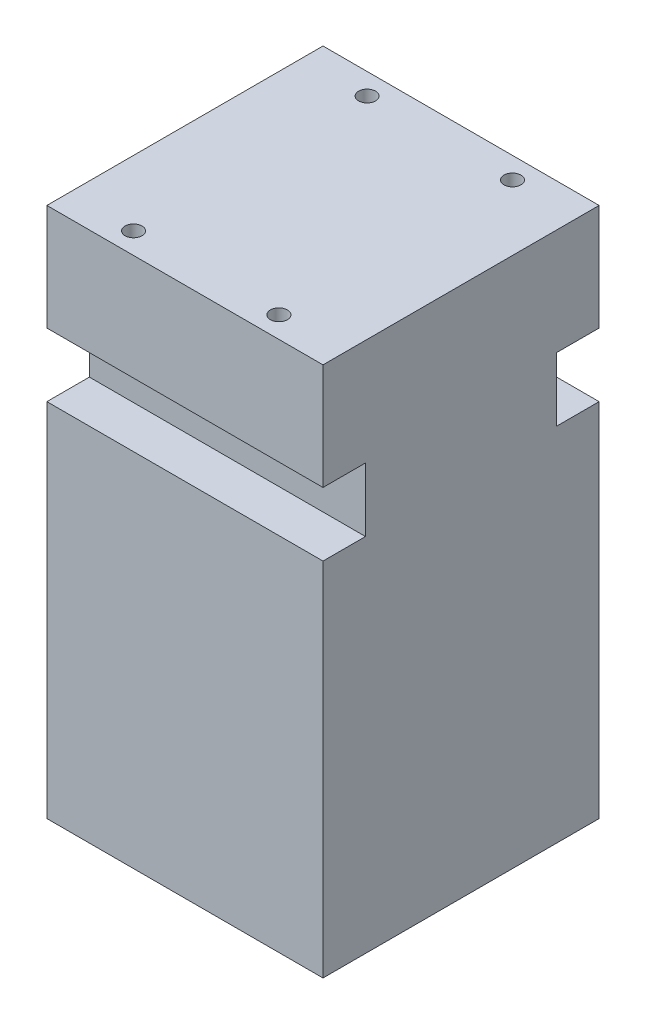
ISO-10303-21;
HEADER;
FILE_DESCRIPTION(('STEP AP214'),'2;1');
FILE_NAME('part.step','',(''),(''),'','','');
FILE_SCHEMA(('AUTOMOTIVE_DESIGN { 1 0 10303 214 1 1 1 1 }'));
ENDSEC;
DATA;
#1=APPLICATION_CONTEXT('core data for automotive mechanical design processes');
#2=APPLICATION_PROTOCOL_DEFINITION('international standard','automotive_design',2000,#1);
#3=PRODUCT_CONTEXT('',#1,'mechanical');
#4=PRODUCT('Part','Part','',(#3));
#5=PRODUCT_RELATED_PRODUCT_CATEGORY('part','',(#4));
#6=PRODUCT_DEFINITION_FORMATION('','',#4);
#7=PRODUCT_DEFINITION_CONTEXT('part definition',#1,'design');
#8=PRODUCT_DEFINITION('design','',#6,#7);
#9=PRODUCT_DEFINITION_SHAPE('','',#8);
#10=(LENGTH_UNIT() NAMED_UNIT(*) SI_UNIT(.MILLI.,.METRE.));
#11=(NAMED_UNIT(*) PLANE_ANGLE_UNIT() SI_UNIT($,.RADIAN.));
#12=(NAMED_UNIT(*) SI_UNIT($,.STERADIAN.) SOLID_ANGLE_UNIT());
#13=UNCERTAINTY_MEASURE_WITH_UNIT(LENGTH_MEASURE(1.E-05),#10,'distance_accuracy_value','');
#14=(GEOMETRIC_REPRESENTATION_CONTEXT(3) GLOBAL_UNCERTAINTY_ASSIGNED_CONTEXT((#13)) GLOBAL_UNIT_ASSIGNED_CONTEXT((#10,
#11,#12)) REPRESENTATION_CONTEXT('',''));
#15=CARTESIAN_POINT('',(0.,0.,0.));
#16=DIRECTION('',(0.,0.,1.));
#17=DIRECTION('',(1.,0.,0.));
#18=AXIS2_PLACEMENT_3D('',#15,#16,#17);
#19=CARTESIAN_POINT('',(0.,500.,-260.));
#20=DIRECTION('',(0.,0.,1.));
#21=DIRECTION('',(1.,0.,0.));
#22=AXIS2_PLACEMENT_3D('',#19,#20,#21);
#23=PLANE('',#22);
#24=DIRECTION('',(0.,-1.,0.));
#25=VECTOR('',#24,1.);
#26=CARTESIAN_POINT('',(0.,500.,-260.));
#27=LINE('',#26,#25);
#28=CARTESIAN_POINT('',(0.,340.,-260.));
#29=VERTEX_POINT('',#28);
#30=CARTESIAN_POINT('',(0.,0.,-260.));
#31=VERTEX_POINT('',#30);
#32=EDGE_CURVE('E138',#29,#31,#27,.T.);
#33=ORIENTED_EDGE('',*,*,#32,.F.);
#34=DIRECTION('',(1.,0.,0.));
#35=VECTOR('',#34,1.);
#36=CARTESIAN_POINT('',(0.,340.,-260.));
#37=LINE('',#36,#35);
#38=CARTESIAN_POINT('',(260.,340.,-260.));
#39=VERTEX_POINT('',#38);
#40=EDGE_CURVE('E122',#29,#39,#37,.T.);
#41=ORIENTED_EDGE('',*,*,#40,.T.);
#42=DIRECTION('',(0.,-1.,0.));
#43=VECTOR('',#42,1.);
#44=CARTESIAN_POINT('',(260.,500.,-260.));
#45=LINE('',#44,#43);
#46=CARTESIAN_POINT('',(260.,0.,-260.));
#47=VERTEX_POINT('',#46);
#48=EDGE_CURVE('E150',#39,#47,#45,.T.);
#49=ORIENTED_EDGE('',*,*,#48,.T.);
#50=DIRECTION('',(-1.,0.,0.));
#51=VECTOR('',#50,1.);
#52=CARTESIAN_POINT('',(0.,0.,-260.));
#53=LINE('',#52,#51);
#54=EDGE_CURVE('E144',#47,#31,#53,.T.);
#55=ORIENTED_EDGE('',*,*,#54,.T.);
#56=EDGE_LOOP('',(#33,#41,#49,#55));
#57=FACE_BOUND('',#56,.T.);
#58=ADVANCED_FACE('F33',(#57),#23,.F.);
#59=CARTESIAN_POINT('',(0.,500.,0.));
#60=DIRECTION('',(1.,0.,0.));
#61=DIRECTION('',(0.,0.,-1.));
#62=AXIS2_PLACEMENT_3D('',#59,#60,#61);
#63=PLANE('',#62);
#64=DIRECTION('',(0.,-1.,0.));
#65=VECTOR('',#64,1.);
#66=CARTESIAN_POINT('',(0.,0.,-220.));
#67=LINE('',#66,#65);
#68=CARTESIAN_POINT('',(0.,400.,-220.));
#69=VERTEX_POINT('',#68);
#70=CARTESIAN_POINT('',(0.,340.,-220.));
#71=VERTEX_POINT('',#70);
#72=EDGE_CURVE('E134',#69,#71,#67,.T.);
#73=ORIENTED_EDGE('',*,*,#72,.T.);
#74=DIRECTION('',(0.,0.,-1.));
#75=VECTOR('',#74,1.);
#76=CARTESIAN_POINT('',(0.,340.,-260.));
#77=LINE('',#76,#75);
#78=EDGE_CURVE('E126',#71,#29,#77,.T.);
#79=ORIENTED_EDGE('',*,*,#78,.T.);
#80=ORIENTED_EDGE('',*,*,#32,.T.);
#81=DIRECTION('',(0.,0.,1.));
#82=VECTOR('',#81,1.);
#83=CARTESIAN_POINT('',(0.,0.,0.));
#84=LINE('',#83,#82);
#85=CARTESIAN_POINT('',(0.,0.,0.));
#86=VERTEX_POINT('',#85);
#87=EDGE_CURVE('E203',#31,#86,#84,.T.);
#88=ORIENTED_EDGE('',*,*,#87,.T.);
#89=DIRECTION('',(0.,-1.,0.));
#90=VECTOR('',#89,1.);
#91=CARTESIAN_POINT('',(0.,500.,0.));
#92=LINE('',#91,#90);
#93=CARTESIAN_POINT('',(0.,340.,0.));
#94=VERTEX_POINT('',#93);
#95=EDGE_CURVE('E163',#94,#86,#92,.T.);
#96=ORIENTED_EDGE('',*,*,#95,.F.);
#97=DIRECTION('',(0.,0.,1.));
#98=VECTOR('',#97,1.);
#99=CARTESIAN_POINT('',(0.,340.,0.));
#100=LINE('',#99,#98);
#101=CARTESIAN_POINT('',(0.,340.,-40.));
#102=VERTEX_POINT('',#101);
#103=EDGE_CURVE('E214',#102,#94,#100,.T.);
#104=ORIENTED_EDGE('',*,*,#103,.F.);
#105=DIRECTION('',(0.,-1.,0.));
#106=VECTOR('',#105,1.);
#107=CARTESIAN_POINT('',(0.,0.,-40.0000000000001));
#108=LINE('',#107,#106);
#109=CARTESIAN_POINT('',(0.,400.,-40.));
#110=VERTEX_POINT('',#109);
#111=EDGE_CURVE('E219',#110,#102,#108,.T.);
#112=ORIENTED_EDGE('',*,*,#111,.F.);
#113=DIRECTION('',(0.,0.,-1.));
#114=VECTOR('',#113,1.);
#115=CARTESIAN_POINT('',(0.,400.,0.));
#116=LINE('',#115,#114);
#117=CARTESIAN_POINT('',(0.,400.,0.));
#118=VERTEX_POINT('',#117);
#119=EDGE_CURVE('E190',#118,#110,#116,.T.);
#120=ORIENTED_EDGE('',*,*,#119,.F.);
#121=CARTESIAN_POINT('',(0.,500.,0.));
#122=VERTEX_POINT('',#121);
#123=EDGE_CURVE('E164',#122,#118,#92,.T.);
#124=ORIENTED_EDGE('',*,*,#123,.F.);
#125=DIRECTION('',(0.,0.,1.));
#126=VECTOR('',#125,1.);
#127=CARTESIAN_POINT('',(0.,500.,0.));
#128=LINE('',#127,#126);
#129=CARTESIAN_POINT('',(0.,500.,-260.));
#130=VERTEX_POINT('',#129);
#131=EDGE_CURVE('E197',#130,#122,#128,.T.);
#132=ORIENTED_EDGE('',*,*,#131,.F.);
#133=CARTESIAN_POINT('',(0.,400.,-260.));
#134=VERTEX_POINT('',#133);
#135=EDGE_CURVE('E146',#130,#134,#27,.T.);
#136=ORIENTED_EDGE('',*,*,#135,.T.);
#137=DIRECTION('',(0.,0.,1.));
#138=VECTOR('',#137,1.);
#139=CARTESIAN_POINT('',(0.,400.,-260.));
#140=LINE('',#139,#138);
#141=EDGE_CURVE('E48',#134,#69,#140,.T.);
#142=ORIENTED_EDGE('',*,*,#141,.T.);
#143=EDGE_LOOP('',(#73,#79,#80,#88,#96,#104,#112,#120,#124,#132,#136,#142));
#144=FACE_BOUND('',#143,.T.);
#145=ADVANCED_FACE('F35',(#144),#63,.F.);
#146=CARTESIAN_POINT('',(0.,500.,0.));
#147=DIRECTION('',(0.,0.,-1.));
#148=DIRECTION('',(-1.,0.,0.));
#149=AXIS2_PLACEMENT_3D('',#146,#147,#148);
#150=PLANE('',#149);
#151=DIRECTION('',(1.,0.,0.));
#152=VECTOR('',#151,1.);
#153=CARTESIAN_POINT('',(0.,340.,0.));
#154=LINE('',#153,#152);
#155=CARTESIAN_POINT('',(260.,340.,0.));
#156=VERTEX_POINT('',#155);
#157=EDGE_CURVE('E176',#94,#156,#154,.T.);
#158=ORIENTED_EDGE('',*,*,#157,.F.);
#159=ORIENTED_EDGE('',*,*,#95,.T.);
#160=DIRECTION('',(1.,0.,0.));
#161=VECTOR('',#160,1.);
#162=CARTESIAN_POINT('',(0.,0.,0.));
#163=LINE('',#162,#161);
#164=CARTESIAN_POINT('',(260.,0.,0.));
#165=VERTEX_POINT('',#164);
#166=EDGE_CURVE('E205',#86,#165,#163,.T.);
#167=ORIENTED_EDGE('',*,*,#166,.T.);
#168=DIRECTION('',(0.,-1.,0.));
#169=VECTOR('',#168,1.);
#170=CARTESIAN_POINT('',(260.,500.,0.));
#171=LINE('',#170,#169);
#172=EDGE_CURVE('E159',#156,#165,#171,.T.);
#173=ORIENTED_EDGE('',*,*,#172,.F.);
#174=EDGE_LOOP('',(#158,#159,#167,#173));
#175=FACE_BOUND('',#174,.T.);
#176=ADVANCED_FACE('F216',(#175),#150,.F.);
#177=DIRECTION('',(1.,0.,0.));
#178=VECTOR('',#177,1.);
#179=CARTESIAN_POINT('',(0.,400.,0.));
#180=LINE('',#179,#178);
#181=CARTESIAN_POINT('',(260.,400.,0.));
#182=VERTEX_POINT('',#181);
#183=EDGE_CURVE('E191',#118,#182,#180,.T.);
#184=ORIENTED_EDGE('',*,*,#183,.T.);
#185=CARTESIAN_POINT('',(260.,500.,0.));
#186=VERTEX_POINT('',#185);
#187=EDGE_CURVE('E160',#186,#182,#171,.T.);
#188=ORIENTED_EDGE('',*,*,#187,.F.);
#189=DIRECTION('',(1.,0.,0.));
#190=VECTOR('',#189,1.);
#191=CARTESIAN_POINT('',(0.,500.,0.));
#192=LINE('',#191,#190);
#193=EDGE_CURVE('E200',#122,#186,#192,.T.);
#194=ORIENTED_EDGE('',*,*,#193,.F.);
#195=ORIENTED_EDGE('',*,*,#123,.T.);
#196=EDGE_LOOP('',(#184,#188,#194,#195));
#197=FACE_BOUND('',#196,.T.);
#198=ADVANCED_FACE('F286',(#197),#150,.F.);
#199=CARTESIAN_POINT('',(260.,500.,0.));
#200=DIRECTION('',(-1.,0.,0.));
#201=DIRECTION('',(0.,0.,1.));
#202=AXIS2_PLACEMENT_3D('',#199,#200,#201);
#203=PLANE('',#202);
#204=ORIENTED_EDGE('',*,*,#48,.F.);
#205=DIRECTION('',(0.,0.,1.));
#206=VECTOR('',#205,1.);
#207=CARTESIAN_POINT('',(260.,340.,0.));
#208=LINE('',#207,#206);
#209=CARTESIAN_POINT('',(260.,340.,-220.));
#210=VERTEX_POINT('',#209);
#211=EDGE_CURVE('E129',#39,#210,#208,.T.);
#212=ORIENTED_EDGE('',*,*,#211,.T.);
#213=DIRECTION('',(0.,1.,0.));
#214=VECTOR('',#213,1.);
#215=CARTESIAN_POINT('',(260.,500.,-220.));
#216=LINE('',#215,#214);
#217=CARTESIAN_POINT('',(260.,400.,-220.));
#218=VERTEX_POINT('',#217);
#219=EDGE_CURVE('E11',#210,#218,#216,.T.);
#220=ORIENTED_EDGE('',*,*,#219,.T.);
#221=DIRECTION('',(0.,0.,-1.));
#222=VECTOR('',#221,1.);
#223=CARTESIAN_POINT('',(260.,400.,0.));
#224=LINE('',#223,#222);
#225=CARTESIAN_POINT('',(260.,400.,-260.));
#226=VERTEX_POINT('',#225);
#227=EDGE_CURVE('E235',#218,#226,#224,.T.);
#228=ORIENTED_EDGE('',*,*,#227,.T.);
#229=CARTESIAN_POINT('',(260.,500.,-260.));
#230=VERTEX_POINT('',#229);
#231=EDGE_CURVE('E156',#230,#226,#45,.T.);
#232=ORIENTED_EDGE('',*,*,#231,.F.);
#233=DIRECTION('',(0.,0.,-1.));
#234=VECTOR('',#233,1.);
#235=CARTESIAN_POINT('',(260.,500.,0.));
#236=LINE('',#235,#234);
#237=EDGE_CURVE('E151',#186,#230,#236,.T.);
#238=ORIENTED_EDGE('',*,*,#237,.F.);
#239=ORIENTED_EDGE('',*,*,#187,.T.);
#240=DIRECTION('',(0.,0.,1.));
#241=VECTOR('',#240,1.);
#242=CARTESIAN_POINT('',(260.,400.,0.));
#243=LINE('',#242,#241);
#244=CARTESIAN_POINT('',(260.,400.,-40.));
#245=VERTEX_POINT('',#244);
#246=EDGE_CURVE('E169',#245,#182,#243,.T.);
#247=ORIENTED_EDGE('',*,*,#246,.F.);
#248=DIRECTION('',(0.,1.,0.));
#249=VECTOR('',#248,1.);
#250=CARTESIAN_POINT('',(260.,500.,-40.));
#251=LINE('',#250,#249);
#252=CARTESIAN_POINT('',(260.,340.,-40.));
#253=VERTEX_POINT('',#252);
#254=EDGE_CURVE('E167',#253,#245,#251,.T.);
#255=ORIENTED_EDGE('',*,*,#254,.F.);
#256=DIRECTION('',(0.,0.,-1.));
#257=VECTOR('',#256,1.);
#258=CARTESIAN_POINT('',(260.,340.,0.));
#259=LINE('',#258,#257);
#260=EDGE_CURVE('E41',#156,#253,#259,.T.);
#261=ORIENTED_EDGE('',*,*,#260,.F.);
#262=ORIENTED_EDGE('',*,*,#172,.T.);
#263=DIRECTION('',(0.,0.,-1.));
#264=VECTOR('',#263,1.);
#265=CARTESIAN_POINT('',(260.,0.,0.));
#266=LINE('',#265,#264);
#267=EDGE_CURVE('E207',#165,#47,#266,.T.);
#268=ORIENTED_EDGE('',*,*,#267,.T.);
#269=EDGE_LOOP('',(#204,#212,#220,#228,#232,#238,#239,#247,#255,#261,#262,#268));
#270=FACE_BOUND('',#269,.T.);
#271=ADVANCED_FACE('F180',(#270),#203,.F.);
#272=ORIENTED_EDGE('',*,*,#231,.T.);
#273=DIRECTION('',(1.,0.,0.));
#274=VECTOR('',#273,1.);
#275=CARTESIAN_POINT('',(0.,400.,-260.));
#276=LINE('',#275,#274);
#277=EDGE_CURVE('E133',#134,#226,#276,.T.);
#278=ORIENTED_EDGE('',*,*,#277,.F.);
#279=ORIENTED_EDGE('',*,*,#135,.F.);
#280=DIRECTION('',(-1.,0.,0.));
#281=VECTOR('',#280,1.);
#282=CARTESIAN_POINT('',(0.,500.,-260.));
#283=LINE('',#282,#281);
#284=EDGE_CURVE('E147',#230,#130,#283,.T.);
#285=ORIENTED_EDGE('',*,*,#284,.F.);
#286=EDGE_LOOP('',(#272,#278,#279,#285));
#287=FACE_BOUND('',#286,.T.);
#288=ADVANCED_FACE('F280',(#287),#23,.F.);
#289=CARTESIAN_POINT('',(0.,500.,0.));
#290=DIRECTION('',(0.,-1.,0.));
#291=DIRECTION('',(0.,0.,-1.));
#292=AXIS2_PLACEMENT_3D('',#289,#290,#291);
#293=PLANE('',#292);
#294=CARTESIAN_POINT('',(61.5561384681201,500.,-239.952034117048));
#295=DIRECTION('',(0.,-1.,0.));
#296=DIRECTION('',(0.,0.,-1.));
#297=AXIS2_PLACEMENT_3D('',#294,#295,#296);
#298=CIRCLE('',#297,8.);
#299=CARTESIAN_POINT('',(61.5561384681201,500.,-247.952034117048));
#300=VERTEX_POINT('',#299);
#301=EDGE_CURVE('E251',#300,#300,#298,.T.);
#302=ORIENTED_EDGE('',*,*,#301,.T.);
#303=EDGE_LOOP('',(#302));
#304=FACE_BOUND('',#303,.T.);
#305=CARTESIAN_POINT('',(198.44386153188,500.,-239.952034117048));
#306=DIRECTION('',(0.,1.,0.));
#307=DIRECTION('',(0.,0.,-1.));
#308=AXIS2_PLACEMENT_3D('',#305,#306,#307);
#309=CIRCLE('',#308,8.);
#310=CARTESIAN_POINT('',(198.44386153188,500.,-247.952034117048));
#311=VERTEX_POINT('',#310);
#312=EDGE_CURVE('E141',#311,#311,#309,.T.);
#313=ORIENTED_EDGE('',*,*,#312,.F.);
#314=EDGE_LOOP('',(#313));
#315=FACE_BOUND('',#314,.T.);
#316=CARTESIAN_POINT('',(198.44386153188,500.,-20.0479658829522));
#317=DIRECTION('',(0.,-1.,0.));
#318=DIRECTION('',(0.,0.,1.));
#319=AXIS2_PLACEMENT_3D('',#316,#317,#318);
#320=CIRCLE('',#319,8.);
#321=CARTESIAN_POINT('',(198.44386153188,500.,-12.0479658829522));
#322=VERTEX_POINT('',#321);
#323=EDGE_CURVE('E226',#322,#322,#320,.T.);
#324=ORIENTED_EDGE('',*,*,#323,.T.);
#325=EDGE_LOOP('',(#324));
#326=FACE_BOUND('',#325,.T.);
#327=CARTESIAN_POINT('',(61.5561384681201,500.,-20.0479658829522));
#328=DIRECTION('',(0.,1.,0.));
#329=DIRECTION('',(0.,0.,1.));
#330=AXIS2_PLACEMENT_3D('',#327,#328,#329);
#331=CIRCLE('',#330,8.);
#332=CARTESIAN_POINT('',(61.5561384681201,500.,-12.0479658829522));
#333=VERTEX_POINT('',#332);
#334=EDGE_CURVE('E222',#333,#333,#331,.T.);
#335=ORIENTED_EDGE('',*,*,#334,.F.);
#336=EDGE_LOOP('',(#335));
#337=FACE_BOUND('',#336,.T.);
#338=ORIENTED_EDGE('',*,*,#131,.T.);
#339=ORIENTED_EDGE('',*,*,#193,.T.);
#340=ORIENTED_EDGE('',*,*,#237,.T.);
#341=ORIENTED_EDGE('',*,*,#284,.T.);
#342=EDGE_LOOP('',(#338,#339,#340,#341));
#343=FACE_BOUND('',#342,.T.);
#344=ADVANCED_FACE('F258',(#304,#315,#326,#337,#343),#293,.F.);
#345=CARTESIAN_POINT('',(0.,0.,0.));
#346=DIRECTION('',(0.,-1.,0.));
#347=DIRECTION('',(0.,0.,-1.));
#348=AXIS2_PLACEMENT_3D('',#345,#346,#347);
#349=PLANE('',#348);
#350=ORIENTED_EDGE('',*,*,#87,.F.);
#351=ORIENTED_EDGE('',*,*,#54,.F.);
#352=ORIENTED_EDGE('',*,*,#267,.F.);
#353=ORIENTED_EDGE('',*,*,#166,.F.);
#354=EDGE_LOOP('',(#350,#351,#352,#353));
#355=FACE_BOUND('',#354,.T.);
#356=ADVANCED_FACE('F212',(#355),#349,.T.);
#357=CARTESIAN_POINT('',(0.,340.,0.));
#358=DIRECTION('',(0.,1.,0.));
#359=DIRECTION('',(0.,0.,1.));
#360=AXIS2_PLACEMENT_3D('',#357,#358,#359);
#361=PLANE('',#360);
#362=ORIENTED_EDGE('',*,*,#260,.T.);
#363=DIRECTION('',(1.,0.,0.));
#364=VECTOR('',#363,1.);
#365=CARTESIAN_POINT('',(0.,340.,-40.));
#366=LINE('',#365,#364);
#367=EDGE_CURVE('E56',#102,#253,#366,.T.);
#368=ORIENTED_EDGE('',*,*,#367,.F.);
#369=ORIENTED_EDGE('',*,*,#103,.T.);
#370=ORIENTED_EDGE('',*,*,#157,.T.);
#371=EDGE_LOOP('',(#362,#368,#369,#370));
#372=FACE_BOUND('',#371,.T.);
#373=ADVANCED_FACE('F173',(#372),#361,.T.);
#374=CARTESIAN_POINT('',(0.,400.,0.));
#375=DIRECTION('',(0.,-1.,0.));
#376=DIRECTION('',(0.,0.,-1.));
#377=AXIS2_PLACEMENT_3D('',#374,#375,#376);
#378=PLANE('',#377);
#379=CARTESIAN_POINT('',(198.44386153188,400.,-20.0479658829522));
#380=DIRECTION('',(0.,-1.,0.));
#381=DIRECTION('',(0.,0.,-1.));
#382=AXIS2_PLACEMENT_3D('',#379,#380,#381);
#383=CIRCLE('',#382,8.);
#384=CARTESIAN_POINT('',(198.44386153188,400.,-28.0479658829522));
#385=VERTEX_POINT('',#384);
#386=EDGE_CURVE('E231',#385,#385,#383,.T.);
#387=ORIENTED_EDGE('',*,*,#386,.F.);
#388=EDGE_LOOP('',(#387));
#389=FACE_BOUND('',#388,.T.);
#390=CARTESIAN_POINT('',(61.5561384681201,400.,-20.0479658829522));
#391=DIRECTION('',(0.,-1.,0.));
#392=DIRECTION('',(0.,0.,-1.));
#393=AXIS2_PLACEMENT_3D('',#390,#391,#392);
#394=CIRCLE('',#393,8.);
#395=CARTESIAN_POINT('',(61.5561384681201,400.,-28.0479658829522));
#396=VERTEX_POINT('',#395);
#397=EDGE_CURVE('E223',#396,#396,#394,.F.);
#398=ORIENTED_EDGE('',*,*,#397,.T.);
#399=EDGE_LOOP('',(#398));
#400=FACE_BOUND('',#399,.T.);
#401=ORIENTED_EDGE('',*,*,#246,.T.);
#402=ORIENTED_EDGE('',*,*,#183,.F.);
#403=ORIENTED_EDGE('',*,*,#119,.T.);
#404=DIRECTION('',(1.,0.,0.));
#405=VECTOR('',#404,1.);
#406=CARTESIAN_POINT('',(0.,400.,-40.));
#407=LINE('',#406,#405);
#408=EDGE_CURVE('E184',#110,#245,#407,.T.);
#409=ORIENTED_EDGE('',*,*,#408,.T.);
#410=EDGE_LOOP('',(#401,#402,#403,#409));
#411=FACE_BOUND('',#410,.T.);
#412=ADVANCED_FACE('F187',(#389,#400,#411),#378,.T.);
#413=CARTESIAN_POINT('',(0.,0.,-40.0000000000001));
#414=DIRECTION('',(0.,0.,1.));
#415=DIRECTION('',(0.,-1.,0.));
#416=AXIS2_PLACEMENT_3D('',#413,#414,#415);
#417=PLANE('',#416);
#418=ORIENTED_EDGE('',*,*,#254,.T.);
#419=ORIENTED_EDGE('',*,*,#408,.F.);
#420=ORIENTED_EDGE('',*,*,#111,.T.);
#421=ORIENTED_EDGE('',*,*,#367,.T.);
#422=EDGE_LOOP('',(#418,#419,#420,#421));
#423=FACE_BOUND('',#422,.T.);
#424=ADVANCED_FACE('F183',(#423),#417,.T.);
#425=CARTESIAN_POINT('',(61.5561384681201,-0.00100000000002876,-20.0479658829522));
#426=DIRECTION('',(0.,1.,0.));
#427=DIRECTION('',(0.,0.,1.));
#428=AXIS2_PLACEMENT_3D('',#425,#426,#427);
#429=CYLINDRICAL_SURFACE('',#428,8.);
#430=ORIENTED_EDGE('',*,*,#397,.F.);
#431=EDGE_LOOP('',(#430));
#432=FACE_BOUND('',#431,.T.);
#433=ORIENTED_EDGE('',*,*,#334,.T.);
#434=EDGE_LOOP('',(#433));
#435=FACE_BOUND('',#434,.T.);
#436=ADVANCED_FACE('F312',(#432,#435),#429,.F.);
#437=CARTESIAN_POINT('',(198.44386153188,-0.00100000000002876,-20.0479658829522));
#438=DIRECTION('',(0.,1.,0.));
#439=DIRECTION('',(0.,0.,1.));
#440=AXIS2_PLACEMENT_3D('',#437,#438,#439);
#441=CYLINDRICAL_SURFACE('',#440,8.);
#442=ORIENTED_EDGE('',*,*,#386,.T.);
#443=EDGE_LOOP('',(#442));
#444=FACE_BOUND('',#443,.T.);
#445=ORIENTED_EDGE('',*,*,#323,.F.);
#446=EDGE_LOOP('',(#445));
#447=FACE_BOUND('',#446,.T.);
#448=ADVANCED_FACE('F318',(#444,#447),#441,.F.);
#449=CARTESIAN_POINT('',(0.,0.,-220.));
#450=DIRECTION('',(0.,0.,1.));
#451=DIRECTION('',(0.,-1.,0.));
#452=AXIS2_PLACEMENT_3D('',#449,#450,#451);
#453=PLANE('',#452);
#454=DIRECTION('',(1.,0.,0.));
#455=VECTOR('',#454,1.);
#456=CARTESIAN_POINT('',(0.,340.,-220.));
#457=LINE('',#456,#455);
#458=EDGE_CURVE('E237',#71,#210,#457,.T.);
#459=ORIENTED_EDGE('',*,*,#458,.F.);
#460=ORIENTED_EDGE('',*,*,#72,.F.);
#461=DIRECTION('',(1.,0.,0.));
#462=VECTOR('',#461,1.);
#463=CARTESIAN_POINT('',(0.,400.,-220.));
#464=LINE('',#463,#462);
#465=EDGE_CURVE('E240',#69,#218,#464,.T.);
#466=ORIENTED_EDGE('',*,*,#465,.T.);
#467=ORIENTED_EDGE('',*,*,#219,.F.);
#468=EDGE_LOOP('',(#459,#460,#466,#467));
#469=FACE_BOUND('',#468,.T.);
#470=ADVANCED_FACE('F274',(#469),#453,.F.);
#471=CARTESIAN_POINT('',(0.,340.,-260.));
#472=DIRECTION('',(0.,-1.,0.));
#473=DIRECTION('',(0.,0.,-1.));
#474=AXIS2_PLACEMENT_3D('',#471,#472,#473);
#475=PLANE('',#474);
#476=ORIENTED_EDGE('',*,*,#40,.F.);
#477=ORIENTED_EDGE('',*,*,#78,.F.);
#478=ORIENTED_EDGE('',*,*,#458,.T.);
#479=ORIENTED_EDGE('',*,*,#211,.F.);
#480=EDGE_LOOP('',(#476,#477,#478,#479));
#481=FACE_BOUND('',#480,.T.);
#482=ADVANCED_FACE('F124',(#481),#475,.F.);
#483=CARTESIAN_POINT('',(0.,400.,-260.));
#484=DIRECTION('',(0.,1.,0.));
#485=DIRECTION('',(0.,0.,1.));
#486=AXIS2_PLACEMENT_3D('',#483,#484,#485);
#487=PLANE('',#486);
#488=CARTESIAN_POINT('',(61.5561384681201,400.,-239.952034117048));
#489=DIRECTION('',(0.,1.,0.));
#490=DIRECTION('',(0.,0.,1.));
#491=AXIS2_PLACEMENT_3D('',#488,#489,#490);
#492=CIRCLE('',#491,8.);
#493=CARTESIAN_POINT('',(61.5561384681201,400.,-231.952034117048));
#494=VERTEX_POINT('',#493);
#495=EDGE_CURVE('E252',#494,#494,#492,.T.);
#496=ORIENTED_EDGE('',*,*,#495,.T.);
#497=EDGE_LOOP('',(#496));
#498=FACE_BOUND('',#497,.T.);
#499=CARTESIAN_POINT('',(198.44386153188,400.,-239.952034117048));
#500=DIRECTION('',(0.,1.,0.));
#501=DIRECTION('',(0.,0.,1.));
#502=AXIS2_PLACEMENT_3D('',#499,#500,#501);
#503=CIRCLE('',#502,8.);
#504=CARTESIAN_POINT('',(198.44386153188,400.,-231.952034117048));
#505=VERTEX_POINT('',#504);
#506=EDGE_CURVE('E248',#505,#505,#503,.F.);
#507=ORIENTED_EDGE('',*,*,#506,.F.);
#508=EDGE_LOOP('',(#507));
#509=FACE_BOUND('',#508,.T.);
#510=ORIENTED_EDGE('',*,*,#465,.F.);
#511=ORIENTED_EDGE('',*,*,#141,.F.);
#512=ORIENTED_EDGE('',*,*,#277,.T.);
#513=ORIENTED_EDGE('',*,*,#227,.F.);
#514=EDGE_LOOP('',(#510,#511,#512,#513));
#515=FACE_BOUND('',#514,.T.);
#516=ADVANCED_FACE('F268',(#498,#509,#515),#487,.F.);
#517=CARTESIAN_POINT('',(198.44386153188,-0.00100000000002876,-239.952034117048));
#518=DIRECTION('',(0.,1.,0.));
#519=DIRECTION('',(0.,0.,1.));
#520=AXIS2_PLACEMENT_3D('',#517,#518,#519);
#521=CYLINDRICAL_SURFACE('',#520,8.);
#522=ORIENTED_EDGE('',*,*,#312,.T.);
#523=EDGE_LOOP('',(#522));
#524=FACE_BOUND('',#523,.T.);
#525=ORIENTED_EDGE('',*,*,#506,.T.);
#526=EDGE_LOOP('',(#525));
#527=FACE_BOUND('',#526,.T.);
#528=ADVANCED_FACE('F264',(#524,#527),#521,.F.);
#529=CARTESIAN_POINT('',(61.5561384681201,-0.00100000000002876,-239.952034117048));
#530=DIRECTION('',(0.,1.,0.));
#531=DIRECTION('',(0.,0.,1.));
#532=AXIS2_PLACEMENT_3D('',#529,#530,#531);
#533=CYLINDRICAL_SURFACE('',#532,8.);
#534=ORIENTED_EDGE('',*,*,#301,.F.);
#535=EDGE_LOOP('',(#534));
#536=FACE_BOUND('',#535,.T.);
#537=ORIENTED_EDGE('',*,*,#495,.F.);
#538=EDGE_LOOP('',(#537));
#539=FACE_BOUND('',#538,.T.);
#540=ADVANCED_FACE('F261',(#536,#539),#533,.F.);
#541=CLOSED_SHELL('',(#58,#145,#176,#198,#271,#288,#344,#356,#373,#412,#424,#436,#448,#470,#482,
#516,#528,#540));
#542=MANIFOLD_SOLID_BREP('B2',#541);
#543=ADVANCED_BREP_SHAPE_REPRESENTATION('',(#18,#542),#14);
#544=SHAPE_DEFINITION_REPRESENTATION(#9,#543);
ENDSEC;
END-ISO-10303-21;
